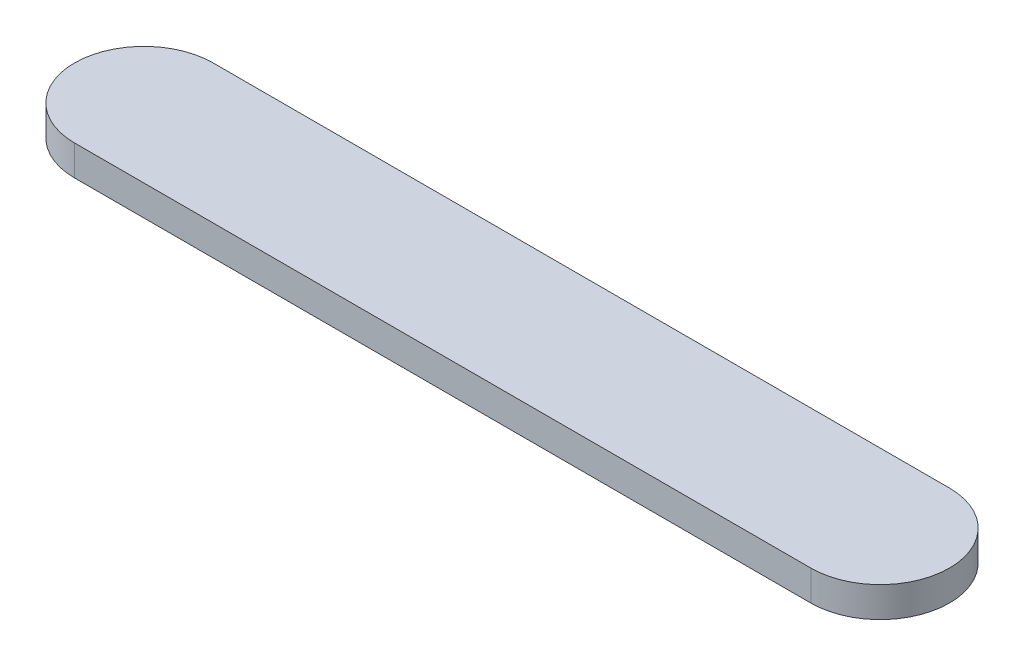
ISO-10303-21;
HEADER;
FILE_DESCRIPTION(('STEP AP214'),'2;1');
FILE_NAME('part.step','',(''),(''),'','','');
FILE_SCHEMA(('AUTOMOTIVE_DESIGN { 1 0 10303 214 1 1 1 1 }'));
ENDSEC;
DATA;
#1=APPLICATION_CONTEXT('core data for automotive mechanical design processes');
#2=APPLICATION_PROTOCOL_DEFINITION('international standard','automotive_design',2000,#1);
#3=PRODUCT_CONTEXT('',#1,'mechanical');
#4=PRODUCT('Part','Part','',(#3));
#5=PRODUCT_RELATED_PRODUCT_CATEGORY('part','',(#4));
#6=PRODUCT_DEFINITION_FORMATION('','',#4);
#7=PRODUCT_DEFINITION_CONTEXT('part definition',#1,'design');
#8=PRODUCT_DEFINITION('design','',#6,#7);
#9=PRODUCT_DEFINITION_SHAPE('','',#8);
#10=(LENGTH_UNIT() NAMED_UNIT(*) SI_UNIT(.MILLI.,.METRE.));
#11=(NAMED_UNIT(*) PLANE_ANGLE_UNIT() SI_UNIT($,.RADIAN.));
#12=(NAMED_UNIT(*) SI_UNIT($,.STERADIAN.) SOLID_ANGLE_UNIT());
#13=UNCERTAINTY_MEASURE_WITH_UNIT(LENGTH_MEASURE(1.E-05),#10,'distance_accuracy_value','');
#14=(GEOMETRIC_REPRESENTATION_CONTEXT(3) GLOBAL_UNCERTAINTY_ASSIGNED_CONTEXT((#13)) GLOBAL_UNIT_ASSIGNED_CONTEXT((#10,
#11,#12)) REPRESENTATION_CONTEXT('',''));
#15=CARTESIAN_POINT('',(0.,0.,0.));
#16=DIRECTION('',(0.,0.,1.));
#17=DIRECTION('',(1.,0.,0.));
#18=AXIS2_PLACEMENT_3D('',#15,#16,#17);
#19=CARTESIAN_POINT('',(0.,3.5,0.));
#20=DIRECTION('',(0.,-1.,0.));
#21=DIRECTION('',(0.,0.,-1.));
#22=AXIS2_PLACEMENT_3D('',#19,#20,#21);
#23=CYLINDRICAL_SURFACE('',#22,8.);
#24=CARTESIAN_POINT('',(0.,0.,0.));
#25=DIRECTION('',(0.,1.,0.));
#26=DIRECTION('',(0.,0.,1.));
#27=AXIS2_PLACEMENT_3D('',#24,#25,#26);
#28=CIRCLE('',#27,8.);
#29=CARTESIAN_POINT('',(0.,0.,-8.));
#30=VERTEX_POINT('',#29);
#31=CARTESIAN_POINT('',(0.,0.,8.));
#32=VERTEX_POINT('',#31);
#33=EDGE_CURVE('E100',#30,#32,#28,.T.);
#34=ORIENTED_EDGE('',*,*,#33,.T.);
#35=DIRECTION('',(0.,-1.,0.));
#36=VECTOR('',#35,1.);
#37=CARTESIAN_POINT('',(0.,3.5,8.));
#38=LINE('',#37,#36);
#39=CARTESIAN_POINT('',(0.,3.5,8.));
#40=VERTEX_POINT('',#39);
#41=EDGE_CURVE('E11',#40,#32,#38,.T.);
#42=ORIENTED_EDGE('',*,*,#41,.F.);
#43=CARTESIAN_POINT('',(0.,3.5,0.));
#44=DIRECTION('',(0.,1.,0.));
#45=DIRECTION('',(0.,0.,1.));
#46=AXIS2_PLACEMENT_3D('',#43,#44,#45);
#47=CIRCLE('',#46,8.);
#48=CARTESIAN_POINT('',(0.,3.5,-8.));
#49=VERTEX_POINT('',#48);
#50=EDGE_CURVE('E88',#49,#40,#47,.T.);
#51=ORIENTED_EDGE('',*,*,#50,.F.);
#52=DIRECTION('',(0.,-1.,0.));
#53=VECTOR('',#52,1.);
#54=CARTESIAN_POINT('',(0.,3.5,-8.));
#55=LINE('',#54,#53);
#56=EDGE_CURVE('E96',#49,#30,#55,.T.);
#57=ORIENTED_EDGE('',*,*,#56,.T.);
#58=EDGE_LOOP('',(#34,#42,#51,#57));
#59=FACE_BOUND('',#58,.T.);
#60=ADVANCED_FACE('F37',(#59),#23,.T.);
#61=CARTESIAN_POINT('',(0.,3.5,8.));
#62=DIRECTION('',(0.,0.,-1.));
#63=DIRECTION('',(-1.,0.,0.));
#64=AXIS2_PLACEMENT_3D('',#61,#62,#63);
#65=PLANE('',#64);
#66=DIRECTION('',(1.,0.,0.));
#67=VECTOR('',#66,1.);
#68=CARTESIAN_POINT('',(0.,0.,8.));
#69=LINE('',#68,#67);
#70=CARTESIAN_POINT('',(85.,0.,8.));
#71=VERTEX_POINT('',#70);
#72=EDGE_CURVE('E92',#32,#71,#69,.T.);
#73=ORIENTED_EDGE('',*,*,#72,.T.);
#74=DIRECTION('',(0.,-1.,0.));
#75=VECTOR('',#74,1.);
#76=CARTESIAN_POINT('',(85.,3.5,8.));
#77=LINE('',#76,#75);
#78=CARTESIAN_POINT('',(85.,3.5,8.));
#79=VERTEX_POINT('',#78);
#80=EDGE_CURVE('E45',#79,#71,#77,.T.);
#81=ORIENTED_EDGE('',*,*,#80,.F.);
#82=DIRECTION('',(1.,0.,0.));
#83=VECTOR('',#82,1.);
#84=CARTESIAN_POINT('',(0.,3.5,8.));
#85=LINE('',#84,#83);
#86=EDGE_CURVE('E83',#40,#79,#85,.T.);
#87=ORIENTED_EDGE('',*,*,#86,.F.);
#88=ORIENTED_EDGE('',*,*,#41,.T.);
#89=EDGE_LOOP('',(#73,#81,#87,#88));
#90=FACE_BOUND('',#89,.T.);
#91=ADVANCED_FACE('F91',(#90),#65,.F.);
#92=CARTESIAN_POINT('',(85.,3.5,0.));
#93=DIRECTION('',(0.,-1.,0.));
#94=DIRECTION('',(0.,0.,-1.));
#95=AXIS2_PLACEMENT_3D('',#92,#93,#94);
#96=CYLINDRICAL_SURFACE('',#95,8.);
#97=CARTESIAN_POINT('',(85.,0.,0.));
#98=DIRECTION('',(0.,1.,0.));
#99=DIRECTION('',(0.,0.,1.));
#100=AXIS2_PLACEMENT_3D('',#97,#98,#99);
#101=CIRCLE('',#100,8.);
#102=CARTESIAN_POINT('',(85.,0.,-8.));
#103=VERTEX_POINT('',#102);
#104=EDGE_CURVE('E70',#71,#103,#101,.T.);
#105=ORIENTED_EDGE('',*,*,#104,.T.);
#106=DIRECTION('',(0.,-1.,0.));
#107=VECTOR('',#106,1.);
#108=CARTESIAN_POINT('',(85.,3.5,-8.));
#109=LINE('',#108,#107);
#110=CARTESIAN_POINT('',(85.,3.5,-8.));
#111=VERTEX_POINT('',#110);
#112=EDGE_CURVE('E93',#111,#103,#109,.T.);
#113=ORIENTED_EDGE('',*,*,#112,.F.);
#114=CARTESIAN_POINT('',(85.,3.5,0.));
#115=DIRECTION('',(0.,1.,0.));
#116=DIRECTION('',(0.,0.,1.));
#117=AXIS2_PLACEMENT_3D('',#114,#115,#116);
#118=CIRCLE('',#117,8.);
#119=EDGE_CURVE('E86',#79,#111,#118,.T.);
#120=ORIENTED_EDGE('',*,*,#119,.F.);
#121=ORIENTED_EDGE('',*,*,#80,.T.);
#122=EDGE_LOOP('',(#105,#113,#120,#121));
#123=FACE_BOUND('',#122,.T.);
#124=ADVANCED_FACE('F94',(#123),#96,.T.);
#125=CARTESIAN_POINT('',(0.,3.5,-8.));
#126=DIRECTION('',(0.,0.,1.));
#127=DIRECTION('',(1.,0.,0.));
#128=AXIS2_PLACEMENT_3D('',#125,#126,#127);
#129=PLANE('',#128);
#130=DIRECTION('',(-1.,0.,0.));
#131=VECTOR('',#130,1.);
#132=CARTESIAN_POINT('',(0.,0.,-8.));
#133=LINE('',#132,#131);
#134=EDGE_CURVE('E76',#103,#30,#133,.T.);
#135=ORIENTED_EDGE('',*,*,#134,.T.);
#136=ORIENTED_EDGE('',*,*,#56,.F.);
#137=DIRECTION('',(-1.,0.,0.));
#138=VECTOR('',#137,1.);
#139=CARTESIAN_POINT('',(0.,3.5,-8.));
#140=LINE('',#139,#138);
#141=EDGE_CURVE('E53',#111,#49,#140,.T.);
#142=ORIENTED_EDGE('',*,*,#141,.F.);
#143=ORIENTED_EDGE('',*,*,#112,.T.);
#144=EDGE_LOOP('',(#135,#136,#142,#143));
#145=FACE_BOUND('',#144,.T.);
#146=ADVANCED_FACE('F107',(#145),#129,.F.);
#147=CARTESIAN_POINT('',(0.,3.5,0.));
#148=DIRECTION('',(0.,1.,0.));
#149=DIRECTION('',(0.,0.,1.));
#150=AXIS2_PLACEMENT_3D('',#147,#148,#149);
#151=PLANE('',#150);
#152=ORIENTED_EDGE('',*,*,#50,.T.);
#153=ORIENTED_EDGE('',*,*,#86,.T.);
#154=ORIENTED_EDGE('',*,*,#119,.T.);
#155=ORIENTED_EDGE('',*,*,#141,.T.);
#156=EDGE_LOOP('',(#152,#153,#154,#155));
#157=FACE_BOUND('',#156,.T.);
#158=ADVANCED_FACE('F84',(#157),#151,.T.);
#159=CARTESIAN_POINT('',(0.,0.,0.));
#160=DIRECTION('',(0.,1.,0.));
#161=DIRECTION('',(0.,0.,1.));
#162=AXIS2_PLACEMENT_3D('',#159,#160,#161);
#163=PLANE('',#162);
#164=ORIENTED_EDGE('',*,*,#33,.F.);
#165=ORIENTED_EDGE('',*,*,#134,.F.);
#166=ORIENTED_EDGE('',*,*,#104,.F.);
#167=ORIENTED_EDGE('',*,*,#72,.F.);
#168=EDGE_LOOP('',(#164,#165,#166,#167));
#169=FACE_BOUND('',#168,.T.);
#170=ADVANCED_FACE('F110',(#169),#163,.F.);
#171=CLOSED_SHELL('',(#60,#91,#124,#146,#158,#170));
#172=MANIFOLD_SOLID_BREP('B2',#171);
#173=ADVANCED_BREP_SHAPE_REPRESENTATION('',(#18,#172),#14);
#174=SHAPE_DEFINITION_REPRESENTATION(#9,#173);
ENDSEC;
END-ISO-10303-21;
